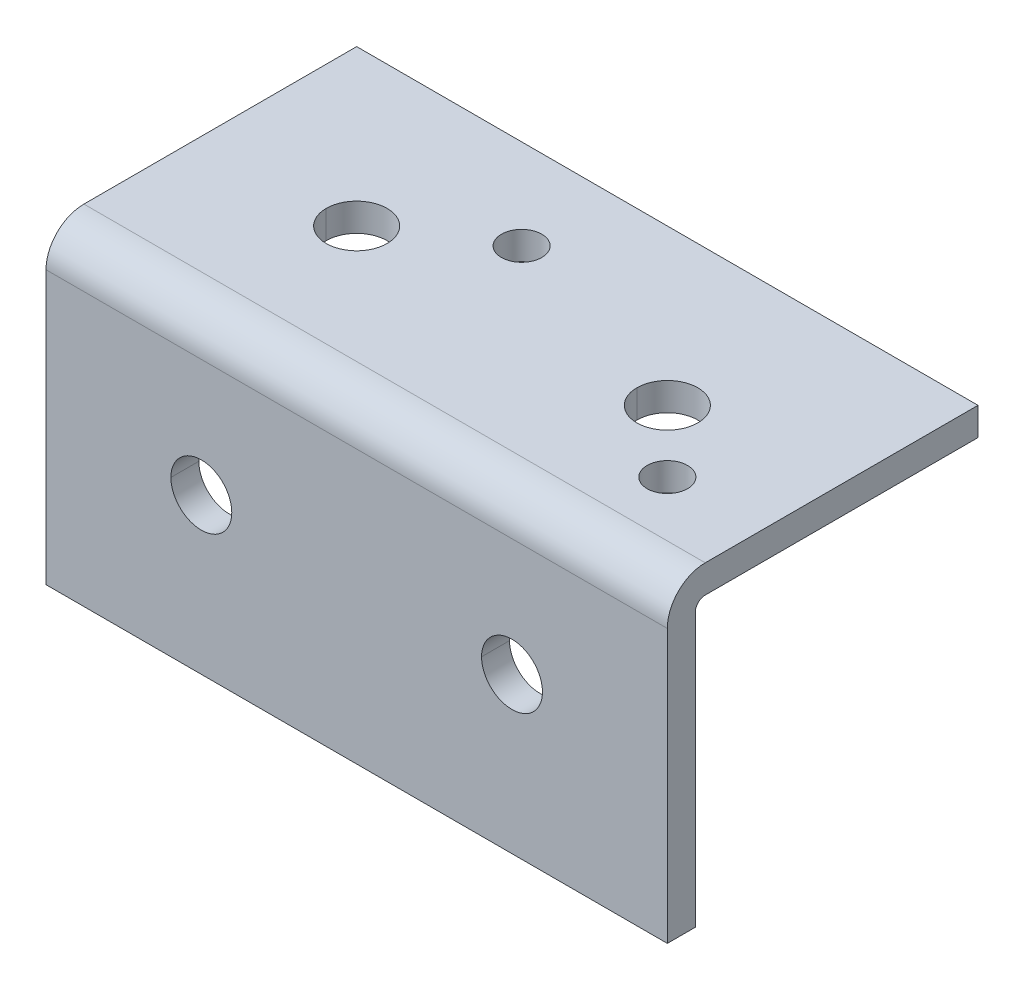
ISO-10303-21;
HEADER;
FILE_DESCRIPTION(('STEP AP214'),'2;1');
FILE_NAME('part.step','',(''),(''),'','','');
FILE_SCHEMA(('AUTOMOTIVE_DESIGN { 1 0 10303 214 1 1 1 1 }'));
ENDSEC;
DATA;
#1=APPLICATION_CONTEXT('core data for automotive mechanical design processes');
#2=APPLICATION_PROTOCOL_DEFINITION('international standard','automotive_design',2000,#1);
#3=PRODUCT_CONTEXT('',#1,'mechanical');
#4=PRODUCT('Part','Part','',(#3));
#5=PRODUCT_RELATED_PRODUCT_CATEGORY('part','',(#4));
#6=PRODUCT_DEFINITION_FORMATION('','',#4);
#7=PRODUCT_DEFINITION_CONTEXT('part definition',#1,'design');
#8=PRODUCT_DEFINITION('design','',#6,#7);
#9=PRODUCT_DEFINITION_SHAPE('','',#8);
#10=(LENGTH_UNIT() NAMED_UNIT(*) SI_UNIT(.MILLI.,.METRE.));
#11=(NAMED_UNIT(*) PLANE_ANGLE_UNIT() SI_UNIT($,.RADIAN.));
#12=(NAMED_UNIT(*) SI_UNIT($,.STERADIAN.) SOLID_ANGLE_UNIT());
#13=UNCERTAINTY_MEASURE_WITH_UNIT(LENGTH_MEASURE(1.E-05),#10,'distance_accuracy_value','');
#14=(GEOMETRIC_REPRESENTATION_CONTEXT(3) GLOBAL_UNCERTAINTY_ASSIGNED_CONTEXT((#13)) GLOBAL_UNIT_ASSIGNED_CONTEXT((#10,
#11,#12)) REPRESENTATION_CONTEXT('',''));
#15=CARTESIAN_POINT('',(0.,0.,0.));
#16=DIRECTION('',(0.,0.,1.));
#17=DIRECTION('',(1.,0.,0.));
#18=AXIS2_PLACEMENT_3D('',#15,#16,#17);
#19=CARTESIAN_POINT('',(-38.1,-25.4,25.4));
#20=DIRECTION('',(0.,0.,-1.));
#21=DIRECTION('',(1.,0.,0.));
#22=AXIS2_PLACEMENT_3D('',#19,#20,#21);
#23=CYLINDRICAL_SURFACE('',#22,2.4892);
#24=DIRECTION('',(0.,0.,-1.));
#25=VECTOR('',#24,1.);
#26=CARTESIAN_POINT('',(-40.5892,-25.4,25.4));
#27=LINE('',#26,#25);
#28=CARTESIAN_POINT('',(-40.5892,-25.4,25.4));
#29=VERTEX_POINT('',#28);
#30=CARTESIAN_POINT('',(-40.5892,-25.4,23.114));
#31=VERTEX_POINT('',#30);
#32=EDGE_CURVE('E160',#29,#31,#27,.T.);
#33=ORIENTED_EDGE('',*,*,#32,.F.);
#34=CARTESIAN_POINT('',(-38.1,-25.4,25.4));
#35=DIRECTION('',(0.,0.,-1.));
#36=DIRECTION('',(1.,0.,0.));
#37=AXIS2_PLACEMENT_3D('',#34,#35,#36);
#38=CIRCLE('',#37,2.4892);
#39=CARTESIAN_POINT('',(-35.6108,-25.4,25.4));
#40=VERTEX_POINT('',#39);
#41=EDGE_CURVE('E145',#40,#29,#38,.T.);
#42=ORIENTED_EDGE('',*,*,#41,.F.);
#43=DIRECTION('',(0.,0.,-1.));
#44=VECTOR('',#43,1.);
#45=CARTESIAN_POINT('',(-35.6108,-25.4,25.4));
#46=LINE('',#45,#44);
#47=CARTESIAN_POINT('',(-35.6108,-25.4,23.114));
#48=VERTEX_POINT('',#47);
#49=EDGE_CURVE('E168',#40,#48,#46,.T.);
#50=ORIENTED_EDGE('',*,*,#49,.T.);
#51=CARTESIAN_POINT('',(-38.1,-25.4,23.114));
#52=DIRECTION('',(0.,0.,-1.));
#53=DIRECTION('',(1.,0.,0.));
#54=AXIS2_PLACEMENT_3D('',#51,#52,#53);
#55=CIRCLE('',#54,2.4892);
#56=EDGE_CURVE('E58',#48,#31,#55,.T.);
#57=ORIENTED_EDGE('',*,*,#56,.T.);
#58=EDGE_LOOP('',(#33,#42,#50,#57));
#59=FACE_BOUND('',#58,.T.);
#60=ADVANCED_FACE('F47',(#59),#23,.F.);
#61=CARTESIAN_POINT('',(-12.7,-25.4,25.4));
#62=DIRECTION('',(0.,0.,-1.));
#63=DIRECTION('',(1.,0.,0.));
#64=AXIS2_PLACEMENT_3D('',#61,#62,#63);
#65=CYLINDRICAL_SURFACE('',#64,2.4892);
#66=DIRECTION('',(0.,0.,-1.));
#67=VECTOR('',#66,1.);
#68=CARTESIAN_POINT('',(-15.1892,-25.4,25.4));
#69=LINE('',#68,#67);
#70=CARTESIAN_POINT('',(-15.1892,-25.4,25.4));
#71=VERTEX_POINT('',#70);
#72=CARTESIAN_POINT('',(-15.1892,-25.4,23.114));
#73=VERTEX_POINT('',#72);
#74=EDGE_CURVE('E220',#71,#73,#69,.T.);
#75=ORIENTED_EDGE('',*,*,#74,.F.);
#76=CARTESIAN_POINT('',(-12.7,-25.4,25.4));
#77=DIRECTION('',(0.,0.,-1.));
#78=DIRECTION('',(1.,0.,0.));
#79=AXIS2_PLACEMENT_3D('',#76,#77,#78);
#80=CIRCLE('',#79,2.4892);
#81=CARTESIAN_POINT('',(-10.2108,-25.4,25.4));
#82=VERTEX_POINT('',#81);
#83=EDGE_CURVE('E155',#82,#71,#80,.T.);
#84=ORIENTED_EDGE('',*,*,#83,.F.);
#85=DIRECTION('',(0.,0.,-1.));
#86=VECTOR('',#85,1.);
#87=CARTESIAN_POINT('',(-10.2108,-25.4,25.4));
#88=LINE('',#87,#86);
#89=CARTESIAN_POINT('',(-10.2108,-25.4,23.114));
#90=VERTEX_POINT('',#89);
#91=EDGE_CURVE('E206',#82,#90,#88,.T.);
#92=ORIENTED_EDGE('',*,*,#91,.T.);
#93=CARTESIAN_POINT('',(-12.7,-25.4,23.114));
#94=DIRECTION('',(0.,0.,-1.));
#95=DIRECTION('',(1.,0.,0.));
#96=AXIS2_PLACEMENT_3D('',#93,#94,#95);
#97=CIRCLE('',#96,2.4892);
#98=EDGE_CURVE('E12',#90,#73,#97,.T.);
#99=ORIENTED_EDGE('',*,*,#98,.T.);
#100=EDGE_LOOP('',(#75,#84,#92,#99));
#101=FACE_BOUND('',#100,.T.);
#102=ADVANCED_FACE('F347',(#101),#65,.F.);
#103=CARTESIAN_POINT('',(-12.7,-12.7,12.7));
#104=DIRECTION('',(0.,-1.,0.));
#105=DIRECTION('',(-1.,0.,0.));
#106=AXIS2_PLACEMENT_3D('',#103,#104,#105);
#107=CYLINDRICAL_SURFACE('',#106,2.4892);
#108=DIRECTION('',(0.,-1.,0.));
#109=VECTOR('',#108,1.);
#110=CARTESIAN_POINT('',(-10.2108,-12.7,12.7));
#111=LINE('',#110,#109);
#112=CARTESIAN_POINT('',(-10.2108,-12.7,12.7));
#113=VERTEX_POINT('',#112);
#114=CARTESIAN_POINT('',(-10.2108,-14.986,12.7));
#115=VERTEX_POINT('',#114);
#116=EDGE_CURVE('E205',#113,#115,#111,.T.);
#117=ORIENTED_EDGE('',*,*,#116,.F.);
#118=CARTESIAN_POINT('',(-12.7,-12.7,12.7));
#119=DIRECTION('',(0.,-1.,0.));
#120=DIRECTION('',(-1.,0.,0.));
#121=AXIS2_PLACEMENT_3D('',#118,#119,#120);
#122=CIRCLE('',#121,2.4892);
#123=CARTESIAN_POINT('',(-15.1892,-12.7,12.7));
#124=VERTEX_POINT('',#123);
#125=EDGE_CURVE('E226',#124,#113,#122,.T.);
#126=ORIENTED_EDGE('',*,*,#125,.F.);
#127=DIRECTION('',(0.,-1.,0.));
#128=VECTOR('',#127,1.);
#129=CARTESIAN_POINT('',(-15.1892,-12.7,12.7));
#130=LINE('',#129,#128);
#131=CARTESIAN_POINT('',(-15.1892,-14.986,12.7));
#132=VERTEX_POINT('',#131);
#133=EDGE_CURVE('E252',#124,#132,#130,.T.);
#134=ORIENTED_EDGE('',*,*,#133,.T.);
#135=CARTESIAN_POINT('',(-12.7,-14.986,12.7));
#136=DIRECTION('',(0.,-1.,0.));
#137=DIRECTION('',(-1.,0.,0.));
#138=AXIS2_PLACEMENT_3D('',#135,#136,#137);
#139=CIRCLE('',#138,2.4892);
#140=EDGE_CURVE('E389',#132,#115,#139,.T.);
#141=ORIENTED_EDGE('',*,*,#140,.T.);
#142=EDGE_LOOP('',(#117,#126,#134,#141));
#143=FACE_BOUND('',#142,.T.);
#144=ADVANCED_FACE('F49',(#143),#107,.F.);
#145=CARTESIAN_POINT('',(-38.1,-12.7,12.7));
#146=DIRECTION('',(0.,-1.,0.));
#147=DIRECTION('',(-1.,0.,0.));
#148=AXIS2_PLACEMENT_3D('',#145,#146,#147);
#149=CYLINDRICAL_SURFACE('',#148,2.4892);
#150=DIRECTION('',(0.,-1.,0.));
#151=VECTOR('',#150,1.);
#152=CARTESIAN_POINT('',(-35.6108,-12.7,12.7));
#153=LINE('',#152,#151);
#154=CARTESIAN_POINT('',(-35.6108,-12.7,12.7));
#155=VERTEX_POINT('',#154);
#156=CARTESIAN_POINT('',(-35.6108,-14.986,12.7));
#157=VERTEX_POINT('',#156);
#158=EDGE_CURVE('E179',#155,#157,#153,.T.);
#159=ORIENTED_EDGE('',*,*,#158,.F.);
#160=CARTESIAN_POINT('',(-38.1,-12.7,12.7));
#161=DIRECTION('',(0.,-1.,0.));
#162=DIRECTION('',(-1.,0.,0.));
#163=AXIS2_PLACEMENT_3D('',#160,#161,#162);
#164=CIRCLE('',#163,2.4892);
#165=CARTESIAN_POINT('',(-40.5892,-12.7,12.7));
#166=VERTEX_POINT('',#165);
#167=EDGE_CURVE('E229',#166,#155,#164,.T.);
#168=ORIENTED_EDGE('',*,*,#167,.F.);
#169=DIRECTION('',(0.,-1.,0.));
#170=VECTOR('',#169,1.);
#171=CARTESIAN_POINT('',(-40.5892,-12.7,12.7));
#172=LINE('',#171,#170);
#173=CARTESIAN_POINT('',(-40.5892,-14.986,12.7));
#174=VERTEX_POINT('',#173);
#175=EDGE_CURVE('E292',#166,#174,#172,.T.);
#176=ORIENTED_EDGE('',*,*,#175,.T.);
#177=CARTESIAN_POINT('',(-38.1,-14.986,12.7));
#178=DIRECTION('',(0.,-1.,0.));
#179=DIRECTION('',(-1.,0.,0.));
#180=AXIS2_PLACEMENT_3D('',#177,#178,#179);
#181=CIRCLE('',#180,2.4892);
#182=EDGE_CURVE('E181',#174,#157,#181,.T.);
#183=ORIENTED_EDGE('',*,*,#182,.T.);
#184=EDGE_LOOP('',(#159,#168,#176,#183));
#185=FACE_BOUND('',#184,.T.);
#186=ADVANCED_FACE('F522',(#185),#149,.F.);
#187=CARTESIAN_POINT('',(-50.8,-12.7,25.400012));
#188=DIRECTION('',(1.,0.,0.));
#189=DIRECTION('',(0.,-1.,0.));
#190=AXIS2_PLACEMENT_3D('',#187,#188,#189);
#191=PLANE('',#190);
#192=CARTESIAN_POINT('',(-50.8,-15.7988,22.3012));
#193=DIRECTION('',(-1.,0.,0.));
#194=DIRECTION('',(0.,-1.,0.));
#195=AXIS2_PLACEMENT_3D('',#192,#193,#194);
#196=CIRCLE('',#195,3.0988);
#197=CARTESIAN_POINT('',(-50.8,-15.7988,25.4));
#198=VERTEX_POINT('',#197);
#199=CARTESIAN_POINT('',(-50.8,-12.7,22.3012));
#200=VERTEX_POINT('',#199);
#201=EDGE_CURVE('E297',#198,#200,#196,.T.);
#202=ORIENTED_EDGE('',*,*,#201,.T.);
#203=DIRECTION('',(0.,0.,-1.));
#204=VECTOR('',#203,1.);
#205=CARTESIAN_POINT('',(-50.8,-12.7,25.400012));
#206=LINE('',#205,#204);
#207=CARTESIAN_POINT('',(-50.8,-12.7,0.));
#208=VERTEX_POINT('',#207);
#209=EDGE_CURVE('E289',#200,#208,#206,.T.);
#210=ORIENTED_EDGE('',*,*,#209,.T.);
#211=DIRECTION('',(0.,-1.,0.));
#212=VECTOR('',#211,1.);
#213=CARTESIAN_POINT('',(-50.8,-12.7,0.));
#214=LINE('',#213,#212);
#215=CARTESIAN_POINT('',(-50.8,-14.986,0.));
#216=VERTEX_POINT('',#215);
#217=EDGE_CURVE('E298',#208,#216,#214,.T.);
#218=ORIENTED_EDGE('',*,*,#217,.T.);
#219=DIRECTION('',(0.,0.,-1.));
#220=VECTOR('',#219,1.);
#221=CARTESIAN_POINT('',(-50.8,-14.986,25.4));
#222=LINE('',#221,#220);
#223=CARTESIAN_POINT('',(-50.8,-14.986,22.3012));
#224=VERTEX_POINT('',#223);
#225=EDGE_CURVE('E272',#224,#216,#222,.T.);
#226=ORIENTED_EDGE('',*,*,#225,.F.);
#227=CARTESIAN_POINT('',(-50.8,-15.7988,22.3012));
#228=DIRECTION('',(-1.,0.,0.));
#229=DIRECTION('',(0.,-1.,0.));
#230=AXIS2_PLACEMENT_3D('',#227,#228,#229);
#231=CIRCLE('',#230,0.8128);
#232=CARTESIAN_POINT('',(-50.8,-15.7988,23.114));
#233=VERTEX_POINT('',#232);
#234=EDGE_CURVE('E282',#233,#224,#231,.T.);
#235=ORIENTED_EDGE('',*,*,#234,.F.);
#236=DIRECTION('',(0.,1.,0.));
#237=VECTOR('',#236,1.);
#238=CARTESIAN_POINT('',(-50.8,-12.7,23.114));
#239=LINE('',#238,#237);
#240=CARTESIAN_POINT('',(-50.8,-38.1,23.114));
#241=VERTEX_POINT('',#240);
#242=EDGE_CURVE('E210',#241,#233,#239,.T.);
#243=ORIENTED_EDGE('',*,*,#242,.F.);
#244=DIRECTION('',(0.,0.,-1.));
#245=VECTOR('',#244,1.);
#246=CARTESIAN_POINT('',(-50.8,-38.1,25.400012));
#247=LINE('',#246,#245);
#248=CARTESIAN_POINT('',(-50.8,-38.1,25.4));
#249=VERTEX_POINT('',#248);
#250=EDGE_CURVE('E215',#249,#241,#247,.T.);
#251=ORIENTED_EDGE('',*,*,#250,.F.);
#252=DIRECTION('',(0.,1.,0.));
#253=VECTOR('',#252,1.);
#254=CARTESIAN_POINT('',(-50.8,-12.7,25.4));
#255=LINE('',#254,#253);
#256=EDGE_CURVE('E192',#249,#198,#255,.T.);
#257=ORIENTED_EDGE('',*,*,#256,.T.);
#258=EDGE_LOOP('',(#202,#210,#218,#226,#235,#243,#251,#257));
#259=FACE_BOUND('',#258,.T.);
#260=ADVANCED_FACE('F418',(#259),#191,.F.);
#261=CARTESIAN_POINT('',(0.,-12.7,25.400012));
#262=DIRECTION('',(1.,0.,0.));
#263=DIRECTION('',(0.,-1.,0.));
#264=AXIS2_PLACEMENT_3D('',#261,#262,#263);
#265=PLANE('',#264);
#266=DIRECTION('',(0.,1.,0.));
#267=VECTOR('',#266,1.);
#268=CARTESIAN_POINT('',(0.,-12.7,25.4));
#269=LINE('',#268,#267);
#270=CARTESIAN_POINT('',(0.,-38.1,25.4));
#271=VERTEX_POINT('',#270);
#272=CARTESIAN_POINT('',(0.,-15.7988,25.4));
#273=VERTEX_POINT('',#272);
#274=EDGE_CURVE('E156',#271,#273,#269,.T.);
#275=ORIENTED_EDGE('',*,*,#274,.F.);
#276=DIRECTION('',(0.,0.,-1.));
#277=VECTOR('',#276,1.);
#278=CARTESIAN_POINT('',(0.,-38.1,25.400012));
#279=LINE('',#278,#277);
#280=CARTESIAN_POINT('',(0.,-38.1,23.114));
#281=VERTEX_POINT('',#280);
#282=EDGE_CURVE('E207',#271,#281,#279,.T.);
#283=ORIENTED_EDGE('',*,*,#282,.T.);
#284=DIRECTION('',(0.,1.,0.));
#285=VECTOR('',#284,1.);
#286=CARTESIAN_POINT('',(0.,-12.7,23.114));
#287=LINE('',#286,#285);
#288=CARTESIAN_POINT('',(0.,-15.7988,23.114));
#289=VERTEX_POINT('',#288);
#290=EDGE_CURVE('E71',#281,#289,#287,.T.);
#291=ORIENTED_EDGE('',*,*,#290,.T.);
#292=CARTESIAN_POINT('',(0.,-15.7988,22.3012));
#293=DIRECTION('',(-1.,0.,0.));
#294=DIRECTION('',(0.,-1.,0.));
#295=AXIS2_PLACEMENT_3D('',#292,#293,#294);
#296=CIRCLE('',#295,0.8128);
#297=CARTESIAN_POINT('',(0.,-14.986,22.3012));
#298=VERTEX_POINT('',#297);
#299=EDGE_CURVE('E279',#289,#298,#296,.T.);
#300=ORIENTED_EDGE('',*,*,#299,.T.);
#301=DIRECTION('',(0.,0.,-1.));
#302=VECTOR('',#301,1.);
#303=CARTESIAN_POINT('',(0.,-14.986,25.4));
#304=LINE('',#303,#302);
#305=CARTESIAN_POINT('',(0.,-14.986,0.));
#306=VERTEX_POINT('',#305);
#307=EDGE_CURVE('E261',#298,#306,#304,.T.);
#308=ORIENTED_EDGE('',*,*,#307,.T.);
#309=DIRECTION('',(0.,-1.,0.));
#310=VECTOR('',#309,1.);
#311=CARTESIAN_POINT('',(0.,-12.7,0.));
#312=LINE('',#311,#310);
#313=CARTESIAN_POINT('',(0.,-12.7,0.));
#314=VERTEX_POINT('',#313);
#315=EDGE_CURVE('E293',#314,#306,#312,.T.);
#316=ORIENTED_EDGE('',*,*,#315,.F.);
#317=DIRECTION('',(0.,0.,-1.));
#318=VECTOR('',#317,1.);
#319=CARTESIAN_POINT('',(0.,-12.7,25.400012));
#320=LINE('',#319,#318);
#321=CARTESIAN_POINT('',(0.,-12.7,22.3012));
#322=VERTEX_POINT('',#321);
#323=EDGE_CURVE('E221',#322,#314,#320,.T.);
#324=ORIENTED_EDGE('',*,*,#323,.F.);
#325=CARTESIAN_POINT('',(0.,-15.7988,22.3012));
#326=DIRECTION('',(-1.,0.,0.));
#327=DIRECTION('',(0.,-1.,0.));
#328=AXIS2_PLACEMENT_3D('',#325,#326,#327);
#329=CIRCLE('',#328,3.0988);
#330=EDGE_CURVE('E304',#273,#322,#329,.T.);
#331=ORIENTED_EDGE('',*,*,#330,.F.);
#332=EDGE_LOOP('',(#275,#283,#291,#300,#308,#316,#324,#331));
#333=FACE_BOUND('',#332,.T.);
#334=ADVANCED_FACE('F403',(#333),#265,.T.);
#335=CARTESIAN_POINT('',(-787.4,-12.7,23.114));
#336=DIRECTION('',(0.,0.,1.));
#337=DIRECTION('',(-1.,0.,0.));
#338=AXIS2_PLACEMENT_3D('',#335,#336,#337);
#339=PLANE('',#338);
#340=ORIENTED_EDGE('',*,*,#98,.F.);
#341=CARTESIAN_POINT('',(-12.7,-25.4,23.114));
#342=DIRECTION('',(0.,0.,-1.));
#343=DIRECTION('',(1.,0.,0.));
#344=AXIS2_PLACEMENT_3D('',#341,#342,#343);
#345=CIRCLE('',#344,2.4892);
#346=EDGE_CURVE('E216',#73,#90,#345,.T.);
#347=ORIENTED_EDGE('',*,*,#346,.F.);
#348=EDGE_LOOP('',(#340,#347));
#349=FACE_BOUND('',#348,.T.);
#350=ORIENTED_EDGE('',*,*,#56,.F.);
#351=CARTESIAN_POINT('',(-38.1,-25.4,23.114));
#352=DIRECTION('',(0.,0.,-1.));
#353=DIRECTION('',(1.,0.,0.));
#354=AXIS2_PLACEMENT_3D('',#351,#352,#353);
#355=CIRCLE('',#354,2.4892);
#356=EDGE_CURVE('E165',#31,#48,#355,.T.);
#357=ORIENTED_EDGE('',*,*,#356,.F.);
#358=EDGE_LOOP('',(#350,#357));
#359=FACE_BOUND('',#358,.T.);
#360=DIRECTION('',(1.,0.,0.));
#361=VECTOR('',#360,1.);
#362=CARTESIAN_POINT('',(-787.4,-38.1,23.114));
#363=LINE('',#362,#361);
#364=EDGE_CURVE('E211',#241,#281,#363,.T.);
#365=ORIENTED_EDGE('',*,*,#364,.F.);
#366=ORIENTED_EDGE('',*,*,#242,.T.);
#367=DIRECTION('',(-1.,0.,0.));
#368=VECTOR('',#367,1.);
#369=CARTESIAN_POINT('',(-787.4,-15.7988,23.114));
#370=LINE('',#369,#368);
#371=EDGE_CURVE('E285',#289,#233,#370,.T.);
#372=ORIENTED_EDGE('',*,*,#371,.F.);
#373=ORIENTED_EDGE('',*,*,#290,.F.);
#374=EDGE_LOOP('',(#365,#366,#372,#373));
#375=FACE_BOUND('',#374,.T.);
#376=ADVANCED_FACE('F489',(#349,#359,#375),#339,.F.);
#377=CARTESIAN_POINT('',(-787.4,-38.1,23.114));
#378=DIRECTION('',(0.,1.,0.));
#379=DIRECTION('',(1.,0.,0.));
#380=AXIS2_PLACEMENT_3D('',#377,#378,#379);
#381=PLANE('',#380);
#382=DIRECTION('',(1.,0.,0.));
#383=VECTOR('',#382,1.);
#384=CARTESIAN_POINT('',(-787.4,-38.1,25.4));
#385=LINE('',#384,#383);
#386=EDGE_CURVE('E197',#249,#271,#385,.T.);
#387=ORIENTED_EDGE('',*,*,#386,.F.);
#388=ORIENTED_EDGE('',*,*,#250,.T.);
#389=ORIENTED_EDGE('',*,*,#364,.T.);
#390=ORIENTED_EDGE('',*,*,#282,.F.);
#391=EDGE_LOOP('',(#387,#388,#389,#390));
#392=FACE_BOUND('',#391,.T.);
#393=ADVANCED_FACE('F488',(#392),#381,.F.);
#394=CARTESIAN_POINT('',(-787.4,-15.7988,22.3012));
#395=DIRECTION('',(1.,0.,0.));
#396=DIRECTION('',(0.,-1.,0.));
#397=AXIS2_PLACEMENT_3D('',#394,#395,#396);
#398=CYLINDRICAL_SURFACE('',#397,0.8128);
#399=ORIENTED_EDGE('',*,*,#371,.T.);
#400=ORIENTED_EDGE('',*,*,#234,.T.);
#401=DIRECTION('',(-1.,0.,0.));
#402=VECTOR('',#401,1.);
#403=CARTESIAN_POINT('',(-787.4,-14.986,22.3012));
#404=LINE('',#403,#402);
#405=EDGE_CURVE('E198',#298,#224,#404,.T.);
#406=ORIENTED_EDGE('',*,*,#405,.F.);
#407=ORIENTED_EDGE('',*,*,#299,.F.);
#408=EDGE_LOOP('',(#399,#400,#406,#407));
#409=FACE_BOUND('',#408,.T.);
#410=ADVANCED_FACE('F491',(#409),#398,.F.);
#411=CARTESIAN_POINT('',(-787.4,-12.7,25.4));
#412=DIRECTION('',(0.,0.,1.));
#413=DIRECTION('',(-1.,0.,0.));
#414=AXIS2_PLACEMENT_3D('',#411,#412,#413);
#415=PLANE('',#414);
#416=ORIENTED_EDGE('',*,*,#83,.T.);
#417=CARTESIAN_POINT('',(-12.7,-25.4,25.4));
#418=DIRECTION('',(0.,0.,-1.));
#419=DIRECTION('',(1.,0.,0.));
#420=AXIS2_PLACEMENT_3D('',#417,#418,#419);
#421=CIRCLE('',#420,2.4892);
#422=EDGE_CURVE('E314',#71,#82,#421,.T.);
#423=ORIENTED_EDGE('',*,*,#422,.T.);
#424=EDGE_LOOP('',(#416,#423));
#425=FACE_BOUND('',#424,.T.);
#426=ORIENTED_EDGE('',*,*,#41,.T.);
#427=CARTESIAN_POINT('',(-38.1,-25.4,25.4));
#428=DIRECTION('',(0.,0.,-1.));
#429=DIRECTION('',(1.,0.,0.));
#430=AXIS2_PLACEMENT_3D('',#427,#428,#429);
#431=CIRCLE('',#430,2.4892);
#432=EDGE_CURVE('E150',#29,#40,#431,.T.);
#433=ORIENTED_EDGE('',*,*,#432,.T.);
#434=EDGE_LOOP('',(#426,#433));
#435=FACE_BOUND('',#434,.T.);
#436=ORIENTED_EDGE('',*,*,#256,.F.);
#437=ORIENTED_EDGE('',*,*,#386,.T.);
#438=ORIENTED_EDGE('',*,*,#274,.T.);
#439=DIRECTION('',(-1.,0.,0.));
#440=VECTOR('',#439,1.);
#441=CARTESIAN_POINT('',(-787.4,-15.7988,25.4));
#442=LINE('',#441,#440);
#443=EDGE_CURVE('E299',#273,#198,#442,.T.);
#444=ORIENTED_EDGE('',*,*,#443,.T.);
#445=EDGE_LOOP('',(#436,#437,#438,#444));
#446=FACE_BOUND('',#445,.T.);
#447=ADVANCED_FACE('F147',(#425,#435,#446),#415,.T.);
#448=CARTESIAN_POINT('',(-787.4,-14.986,25.4));
#449=DIRECTION('',(0.,1.,0.));
#450=DIRECTION('',(1.,0.,0.));
#451=AXIS2_PLACEMENT_3D('',#448,#449,#450);
#452=PLANE('',#451);
#453=CARTESIAN_POINT('',(-7.62,-14.986,17.78));
#454=DIRECTION('',(0.,-1.,0.));
#455=DIRECTION('',(0.,0.,-1.));
#456=AXIS2_PLACEMENT_3D('',#453,#454,#455);
#457=CIRCLE('',#456,1.65100000000001);
#458=CARTESIAN_POINT('',(-7.62,-14.986,16.129));
#459=VERTEX_POINT('',#458);
#460=EDGE_CURVE('E533',#459,#459,#457,.T.);
#461=ORIENTED_EDGE('',*,*,#460,.F.);
#462=EDGE_LOOP('',(#461));
#463=FACE_BOUND('',#462,.T.);
#464=CARTESIAN_POINT('',(-29.9488971514493,-14.986,7.36599999999999));
#465=DIRECTION('',(0.,-1.,0.));
#466=DIRECTION('',(0.,0.,-1.));
#467=AXIS2_PLACEMENT_3D('',#464,#465,#466);
#468=CIRCLE('',#467,1.651);
#469=CARTESIAN_POINT('',(-29.9488971514493,-14.986,5.71499999999999));
#470=VERTEX_POINT('',#469);
#471=EDGE_CURVE('E537',#470,#470,#468,.T.);
#472=ORIENTED_EDGE('',*,*,#471,.F.);
#473=EDGE_LOOP('',(#472));
#474=FACE_BOUND('',#473,.T.);
#475=ORIENTED_EDGE('',*,*,#182,.F.);
#476=CARTESIAN_POINT('',(-38.1,-14.986,12.7));
#477=DIRECTION('',(0.,-1.,0.));
#478=DIRECTION('',(-1.,0.,0.));
#479=AXIS2_PLACEMENT_3D('',#476,#477,#478);
#480=CIRCLE('',#479,2.4892);
#481=EDGE_CURVE('E378',#157,#174,#480,.T.);
#482=ORIENTED_EDGE('',*,*,#481,.F.);
#483=EDGE_LOOP('',(#475,#482));
#484=FACE_BOUND('',#483,.T.);
#485=ORIENTED_EDGE('',*,*,#140,.F.);
#486=CARTESIAN_POINT('',(-12.7,-14.986,12.7));
#487=DIRECTION('',(0.,-1.,0.));
#488=DIRECTION('',(-1.,0.,0.));
#489=AXIS2_PLACEMENT_3D('',#486,#487,#488);
#490=CIRCLE('',#489,2.4892);
#491=EDGE_CURVE('E256',#115,#132,#490,.T.);
#492=ORIENTED_EDGE('',*,*,#491,.F.);
#493=EDGE_LOOP('',(#485,#492));
#494=FACE_BOUND('',#493,.T.);
#495=ORIENTED_EDGE('',*,*,#405,.T.);
#496=ORIENTED_EDGE('',*,*,#225,.T.);
#497=DIRECTION('',(-1.,0.,0.));
#498=VECTOR('',#497,1.);
#499=CARTESIAN_POINT('',(-787.4,-14.986,0.));
#500=LINE('',#499,#498);
#501=EDGE_CURVE('E237',#306,#216,#500,.T.);
#502=ORIENTED_EDGE('',*,*,#501,.F.);
#503=ORIENTED_EDGE('',*,*,#307,.F.);
#504=EDGE_LOOP('',(#495,#496,#502,#503));
#505=FACE_BOUND('',#504,.T.);
#506=ADVANCED_FACE('F413',(#463,#474,#484,#494,#505),#452,.F.);
#507=CARTESIAN_POINT('',(-787.4,-15.7988,22.3012));
#508=DIRECTION('',(1.,0.,0.));
#509=DIRECTION('',(0.,-1.,0.));
#510=AXIS2_PLACEMENT_3D('',#507,#508,#509);
#511=CYLINDRICAL_SURFACE('',#510,3.0988);
#512=ORIENTED_EDGE('',*,*,#201,.F.);
#513=ORIENTED_EDGE('',*,*,#443,.F.);
#514=ORIENTED_EDGE('',*,*,#330,.T.);
#515=DIRECTION('',(-1.,0.,0.));
#516=VECTOR('',#515,1.);
#517=CARTESIAN_POINT('',(-787.4,-12.7,22.3012));
#518=LINE('',#517,#516);
#519=EDGE_CURVE('E225',#322,#200,#518,.T.);
#520=ORIENTED_EDGE('',*,*,#519,.T.);
#521=EDGE_LOOP('',(#512,#513,#514,#520));
#522=FACE_BOUND('',#521,.T.);
#523=ADVANCED_FACE('F484',(#522),#511,.T.);
#524=CARTESIAN_POINT('',(-787.4,-12.7,0.));
#525=DIRECTION('',(0.,0.,1.));
#526=DIRECTION('',(-1.,0.,0.));
#527=AXIS2_PLACEMENT_3D('',#524,#525,#526);
#528=PLANE('',#527);
#529=ORIENTED_EDGE('',*,*,#501,.T.);
#530=ORIENTED_EDGE('',*,*,#217,.F.);
#531=DIRECTION('',(-1.,0.,0.));
#532=VECTOR('',#531,1.);
#533=CARTESIAN_POINT('',(-787.4,-12.7,0.));
#534=LINE('',#533,#532);
#535=EDGE_CURVE('E224',#314,#208,#534,.T.);
#536=ORIENTED_EDGE('',*,*,#535,.F.);
#537=ORIENTED_EDGE('',*,*,#315,.T.);
#538=EDGE_LOOP('',(#529,#530,#536,#537));
#539=FACE_BOUND('',#538,.T.);
#540=ADVANCED_FACE('F411',(#539),#528,.F.);
#541=CARTESIAN_POINT('',(-787.4,-12.7,25.4));
#542=DIRECTION('',(0.,1.,0.));
#543=DIRECTION('',(1.,0.,0.));
#544=AXIS2_PLACEMENT_3D('',#541,#542,#543);
#545=PLANE('',#544);
#546=CARTESIAN_POINT('',(-7.62,-12.7,17.78));
#547=DIRECTION('',(0.,1.,0.));
#548=DIRECTION('',(0.,0.,1.));
#549=AXIS2_PLACEMENT_3D('',#546,#547,#548);
#550=CIRCLE('',#549,1.65100000000001);
#551=CARTESIAN_POINT('',(-7.62,-12.7,19.431));
#552=VERTEX_POINT('',#551);
#553=EDGE_CURVE('E51',#552,#552,#550,.T.);
#554=ORIENTED_EDGE('',*,*,#553,.F.);
#555=EDGE_LOOP('',(#554));
#556=FACE_BOUND('',#555,.T.);
#557=CARTESIAN_POINT('',(-29.9488971514493,-12.7,7.36599999999999));
#558=DIRECTION('',(0.,1.,0.));
#559=DIRECTION('',(0.,0.,1.));
#560=AXIS2_PLACEMENT_3D('',#557,#558,#559);
#561=CIRCLE('',#560,1.651);
#562=CARTESIAN_POINT('',(-29.9488971514493,-12.7,9.01699999999999));
#563=VERTEX_POINT('',#562);
#564=EDGE_CURVE('E175',#563,#563,#561,.T.);
#565=ORIENTED_EDGE('',*,*,#564,.F.);
#566=EDGE_LOOP('',(#565));
#567=FACE_BOUND('',#566,.T.);
#568=ORIENTED_EDGE('',*,*,#167,.T.);
#569=CARTESIAN_POINT('',(-38.1,-12.7,12.7));
#570=DIRECTION('',(0.,-1.,0.));
#571=DIRECTION('',(-1.,0.,0.));
#572=AXIS2_PLACEMENT_3D('',#569,#570,#571);
#573=CIRCLE('',#572,2.4892);
#574=EDGE_CURVE('E255',#155,#166,#573,.T.);
#575=ORIENTED_EDGE('',*,*,#574,.T.);
#576=EDGE_LOOP('',(#568,#575));
#577=FACE_BOUND('',#576,.T.);
#578=ORIENTED_EDGE('',*,*,#125,.T.);
#579=CARTESIAN_POINT('',(-12.7,-12.7,12.7));
#580=DIRECTION('',(0.,-1.,0.));
#581=DIRECTION('',(-1.,0.,0.));
#582=AXIS2_PLACEMENT_3D('',#579,#580,#581);
#583=CIRCLE('',#582,2.4892);
#584=EDGE_CURVE('E201',#113,#124,#583,.T.);
#585=ORIENTED_EDGE('',*,*,#584,.T.);
#586=EDGE_LOOP('',(#578,#585));
#587=FACE_BOUND('',#586,.T.);
#588=ORIENTED_EDGE('',*,*,#209,.F.);
#589=ORIENTED_EDGE('',*,*,#519,.F.);
#590=ORIENTED_EDGE('',*,*,#323,.T.);
#591=ORIENTED_EDGE('',*,*,#535,.T.);
#592=EDGE_LOOP('',(#588,#589,#590,#591));
#593=FACE_BOUND('',#592,.T.);
#594=ADVANCED_FACE('F459',(#556,#567,#577,#587,#593),#545,.T.);
#595=CARTESIAN_POINT('',(-38.1,-12.7,12.7));
#596=DIRECTION('',(0.,-1.,0.));
#597=DIRECTION('',(-1.,0.,0.));
#598=AXIS2_PLACEMENT_3D('',#595,#596,#597);
#599=CYLINDRICAL_SURFACE('',#598,2.4892);
#600=ORIENTED_EDGE('',*,*,#574,.F.);
#601=ORIENTED_EDGE('',*,*,#158,.T.);
#602=ORIENTED_EDGE('',*,*,#481,.T.);
#603=ORIENTED_EDGE('',*,*,#175,.F.);
#604=EDGE_LOOP('',(#600,#601,#602,#603));
#605=FACE_BOUND('',#604,.T.);
#606=ADVANCED_FACE('F461',(#605),#599,.F.);
#607=CARTESIAN_POINT('',(-12.7,-12.7,12.7));
#608=DIRECTION('',(0.,-1.,0.));
#609=DIRECTION('',(-1.,0.,0.));
#610=AXIS2_PLACEMENT_3D('',#607,#608,#609);
#611=CYLINDRICAL_SURFACE('',#610,2.4892);
#612=ORIENTED_EDGE('',*,*,#584,.F.);
#613=ORIENTED_EDGE('',*,*,#116,.T.);
#614=ORIENTED_EDGE('',*,*,#491,.T.);
#615=ORIENTED_EDGE('',*,*,#133,.F.);
#616=EDGE_LOOP('',(#612,#613,#614,#615));
#617=FACE_BOUND('',#616,.T.);
#618=ADVANCED_FACE('F458',(#617),#611,.F.);
#619=CARTESIAN_POINT('',(-12.7,-25.4,25.4));
#620=DIRECTION('',(0.,0.,-1.));
#621=DIRECTION('',(1.,0.,0.));
#622=AXIS2_PLACEMENT_3D('',#619,#620,#621);
#623=CYLINDRICAL_SURFACE('',#622,2.4892);
#624=ORIENTED_EDGE('',*,*,#422,.F.);
#625=ORIENTED_EDGE('',*,*,#74,.T.);
#626=ORIENTED_EDGE('',*,*,#346,.T.);
#627=ORIENTED_EDGE('',*,*,#91,.F.);
#628=EDGE_LOOP('',(#624,#625,#626,#627));
#629=FACE_BOUND('',#628,.T.);
#630=ADVANCED_FACE('F353',(#629),#623,.F.);
#631=CARTESIAN_POINT('',(-38.1,-25.4,25.4));
#632=DIRECTION('',(0.,0.,-1.));
#633=DIRECTION('',(1.,0.,0.));
#634=AXIS2_PLACEMENT_3D('',#631,#632,#633);
#635=CYLINDRICAL_SURFACE('',#634,2.4892);
#636=ORIENTED_EDGE('',*,*,#432,.F.);
#637=ORIENTED_EDGE('',*,*,#32,.T.);
#638=ORIENTED_EDGE('',*,*,#356,.T.);
#639=ORIENTED_EDGE('',*,*,#49,.F.);
#640=EDGE_LOOP('',(#636,#637,#638,#639));
#641=FACE_BOUND('',#640,.T.);
#642=ADVANCED_FACE('F167',(#641),#635,.F.);
#643=CARTESIAN_POINT('',(-29.9488971514493,-4.812,7.36599999999999));
#644=DIRECTION('',(0.,-1.,0.));
#645=DIRECTION('',(0.,0.,-1.));
#646=AXIS2_PLACEMENT_3D('',#643,#644,#645);
#647=CYLINDRICAL_SURFACE('',#646,1.651);
#648=ORIENTED_EDGE('',*,*,#564,.T.);
#649=EDGE_LOOP('',(#648));
#650=FACE_BOUND('',#649,.T.);
#651=ORIENTED_EDGE('',*,*,#471,.T.);
#652=EDGE_LOOP('',(#651));
#653=FACE_BOUND('',#652,.T.);
#654=ADVANCED_FACE('F513',(#650,#653),#647,.F.);
#655=CARTESIAN_POINT('',(-7.62,-4.812,17.78));
#656=DIRECTION('',(0.,-1.,0.));
#657=DIRECTION('',(0.,0.,-1.));
#658=AXIS2_PLACEMENT_3D('',#655,#656,#657);
#659=CYLINDRICAL_SURFACE('',#658,1.65100000000001);
#660=ORIENTED_EDGE('',*,*,#553,.T.);
#661=EDGE_LOOP('',(#660));
#662=FACE_BOUND('',#661,.T.);
#663=ORIENTED_EDGE('',*,*,#460,.T.);
#664=EDGE_LOOP('',(#663));
#665=FACE_BOUND('',#664,.T.);
#666=ADVANCED_FACE('F704',(#662,#665),#659,.F.);
#667=CLOSED_SHELL('',(#60,#102,#144,#186,#260,#334,#376,#393,#410,#447,#506,#523,#540,#594,#606,
#618,#630,#642,#654,#666));
#668=MANIFOLD_SOLID_BREP('B2',#667);
#669=ADVANCED_BREP_SHAPE_REPRESENTATION('',(#18,#668),#14);
#670=SHAPE_DEFINITION_REPRESENTATION(#9,#669);
ENDSEC;
END-ISO-10303-21;
